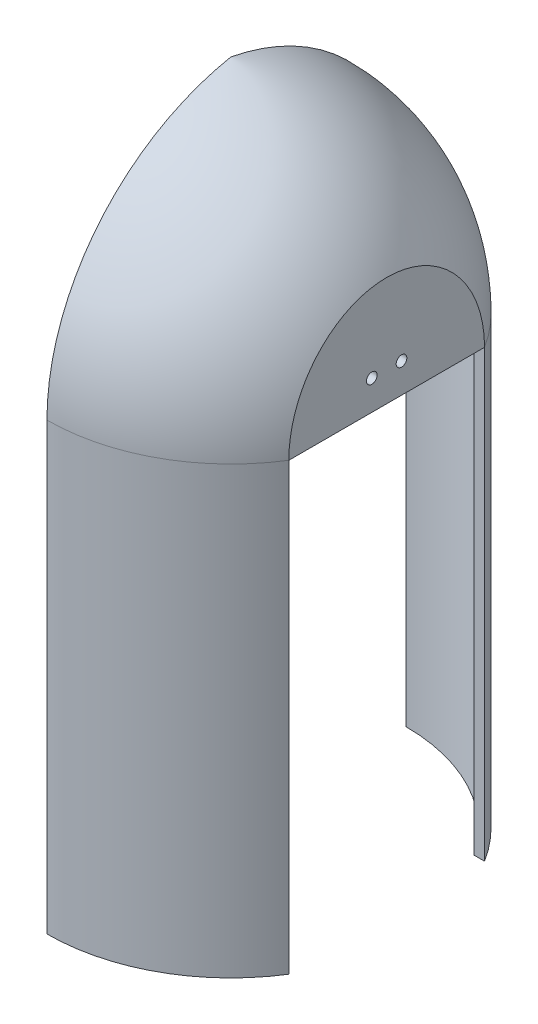
ISO-10303-21;
HEADER;
FILE_DESCRIPTION(('STEP AP214'),'2;1');
FILE_NAME('part.step','',(''),(''),'','','');
FILE_SCHEMA(('AUTOMOTIVE_DESIGN { 1 0 10303 214 1 1 1 1 }'));
ENDSEC;
DATA;
#1=APPLICATION_CONTEXT('core data for automotive mechanical design processes');
#2=APPLICATION_PROTOCOL_DEFINITION('international standard','automotive_design',2000,#1);
#3=PRODUCT_CONTEXT('',#1,'mechanical');
#4=PRODUCT('Part','Part','',(#3));
#5=PRODUCT_RELATED_PRODUCT_CATEGORY('part','',(#4));
#6=PRODUCT_DEFINITION_FORMATION('','',#4);
#7=PRODUCT_DEFINITION_CONTEXT('part definition',#1,'design');
#8=PRODUCT_DEFINITION('design','',#6,#7);
#9=PRODUCT_DEFINITION_SHAPE('','',#8);
#10=(LENGTH_UNIT() NAMED_UNIT(*) SI_UNIT(.MILLI.,.METRE.));
#11=(NAMED_UNIT(*) PLANE_ANGLE_UNIT() SI_UNIT($,.RADIAN.));
#12=(NAMED_UNIT(*) SI_UNIT($,.STERADIAN.) SOLID_ANGLE_UNIT());
#13=UNCERTAINTY_MEASURE_WITH_UNIT(LENGTH_MEASURE(1.E-05),#10,'distance_accuracy_value','');
#14=(GEOMETRIC_REPRESENTATION_CONTEXT(3) GLOBAL_UNCERTAINTY_ASSIGNED_CONTEXT((#13)) GLOBAL_UNIT_ASSIGNED_CONTEXT((#10,
#11,#12)) REPRESENTATION_CONTEXT('',''));
#15=CARTESIAN_POINT('',(0.,0.,0.));
#16=DIRECTION('',(0.,0.,1.));
#17=DIRECTION('',(1.,0.,0.));
#18=AXIS2_PLACEMENT_3D('',#15,#16,#17);
#19=CARTESIAN_POINT('',(0.,-150.,0.));
#20=DIRECTION('',(0.,1.,0.));
#21=DIRECTION('',(0.,0.,1.));
#22=AXIS2_PLACEMENT_3D('',#19,#20,#21);
#23=CYLINDRICAL_SURFACE('',#22,62.);
#24=DIRECTION('',(0.,1.,0.));
#25=VECTOR('',#24,1.);
#26=CARTESIAN_POINT('',(0.,81.3690947224046,62.));
#27=LINE('',#26,#25);
#28=CARTESIAN_POINT('',(0.,-150.,62.));
#29=VERTEX_POINT('',#28);
#30=CARTESIAN_POINT('',(0.,0.,62.));
#31=VERTEX_POINT('',#30);
#32=EDGE_CURVE('E140',#29,#31,#27,.T.);
#33=ORIENTED_EDGE('',*,*,#32,.F.);
#34=CARTESIAN_POINT('',(0.,-150.,0.));
#35=DIRECTION('',(0.,-1.,0.));
#36=DIRECTION('',(0.,0.,-1.));
#37=AXIS2_PLACEMENT_3D('',#34,#35,#36);
#38=CIRCLE('',#37,62.);
#39=CARTESIAN_POINT('',(52.5006628529583,-150.,32.98));
#40=VERTEX_POINT('',#39);
#41=EDGE_CURVE('E214',#40,#29,#38,.T.);
#42=ORIENTED_EDGE('',*,*,#41,.F.);
#43=DIRECTION('',(0.,1.,0.));
#44=VECTOR('',#43,1.);
#45=CARTESIAN_POINT('',(52.5006628529583,-150.,32.98));
#46=LINE('',#45,#44);
#47=CARTESIAN_POINT('',(52.5006628529583,0.,32.98));
#48=VERTEX_POINT('',#47);
#49=EDGE_CURVE('E217',#40,#48,#46,.T.);
#50=ORIENTED_EDGE('',*,*,#49,.T.);
#51=CARTESIAN_POINT('',(0.,0.,0.));
#52=DIRECTION('',(0.,-1.,0.));
#53=DIRECTION('',(0.,0.,-1.));
#54=AXIS2_PLACEMENT_3D('',#51,#52,#53);
#55=CIRCLE('',#54,62.);
#56=CARTESIAN_POINT('',(52.5,0.,32.981055168081));
#57=VERTEX_POINT('',#56);
#58=EDGE_CURVE('E212',#48,#57,#55,.T.);
#59=ORIENTED_EDGE('',*,*,#58,.T.);
#60=CARTESIAN_POINT('',(0.,0.,0.));
#61=DIRECTION('',(0.,1.,0.));
#62=DIRECTION('',(0.,0.,1.));
#63=AXIS2_PLACEMENT_3D('',#60,#61,#62);
#64=CIRCLE('',#63,62.);
#65=EDGE_CURVE('E146',#31,#57,#64,.T.);
#66=ORIENTED_EDGE('',*,*,#65,.F.);
#67=EDGE_LOOP('',(#33,#42,#50,#59,#66));
#68=FACE_BOUND('',#67,.T.);
#69=ADVANCED_FACE('F34',(#68),#23,.T.);
#70=CARTESIAN_POINT('',(62.,0.,0.));
#71=DIRECTION('',(0.,1.,0.));
#72=DIRECTION('',(0.,0.,1.));
#73=AXIS2_PLACEMENT_3D('',#70,#71,#72);
#74=PLANE('',#73);
#75=CARTESIAN_POINT('',(0.,0.,0.));
#76=DIRECTION('',(0.,1.,0.));
#77=DIRECTION('',(0.,0.,1.));
#78=AXIS2_PLACEMENT_3D('',#75,#76,#77);
#79=CIRCLE('',#78,59.);
#80=CARTESIAN_POINT('',(48.9215657966913,0.,-32.98));
#81=VERTEX_POINT('',#80);
#82=CARTESIAN_POINT('',(48.9208544487931,0.,-32.9810551680809));
#83=VERTEX_POINT('',#82);
#84=EDGE_CURVE('E130',#81,#83,#79,.T.);
#85=ORIENTED_EDGE('',*,*,#84,.F.);
#86=DIRECTION('',(-1.,0.,0.));
#87=VECTOR('',#86,1.);
#88=CARTESIAN_POINT('',(48.9215657966913,0.,-32.98));
#89=LINE('',#88,#87);
#90=CARTESIAN_POINT('',(52.5,0.,-32.98));
#91=VERTEX_POINT('',#90);
#92=EDGE_CURVE('E198',#91,#81,#89,.T.);
#93=ORIENTED_EDGE('',*,*,#92,.F.);
#94=DIRECTION('',(0.,0.,-1.));
#95=VECTOR('',#94,1.);
#96=CARTESIAN_POINT('',(52.5,0.,0.));
#97=LINE('',#96,#95);
#98=CARTESIAN_POINT('',(52.5,0.,32.98));
#99=VERTEX_POINT('',#98);
#100=EDGE_CURVE('E157',#99,#91,#97,.T.);
#101=ORIENTED_EDGE('',*,*,#100,.F.);
#102=DIRECTION('',(1.,0.,0.));
#103=VECTOR('',#102,1.);
#104=CARTESIAN_POINT('',(48.9215657966913,0.,32.98));
#105=LINE('',#104,#103);
#106=CARTESIAN_POINT('',(48.9215657966913,0.,32.98));
#107=VERTEX_POINT('',#106);
#108=EDGE_CURVE('E59',#107,#99,#105,.T.);
#109=ORIENTED_EDGE('',*,*,#108,.F.);
#110=CARTESIAN_POINT('',(0.,0.,0.));
#111=DIRECTION('',(0.,1.,0.));
#112=DIRECTION('',(0.,0.,-1.));
#113=AXIS2_PLACEMENT_3D('',#110,#111,#112);
#114=CIRCLE('',#113,59.);
#115=CARTESIAN_POINT('',(48.9208544487931,0.,32.981055168081));
#116=VERTEX_POINT('',#115);
#117=EDGE_CURVE('E208',#116,#107,#114,.T.);
#118=ORIENTED_EDGE('',*,*,#117,.F.);
#119=DIRECTION('',(0.,0.,-1.));
#120=VECTOR('',#119,1.);
#121=CARTESIAN_POINT('',(48.9208544487931,0.,32.9810551680809));
#122=LINE('',#121,#120);
#123=EDGE_CURVE('E227',#116,#83,#122,.T.);
#124=ORIENTED_EDGE('',*,*,#123,.T.);
#125=EDGE_LOOP('',(#85,#93,#101,#109,#118,#124));
#126=FACE_BOUND('',#125,.T.);
#127=ADVANCED_FACE('F248',(#126),#74,.F.);
#128=CARTESIAN_POINT('',(0.,0.,-14.3629032258065));
#129=DIRECTION('',(-1.,0.,0.));
#130=DIRECTION('',(0.,0.,1.));
#131=AXIS2_PLACEMENT_3D('',#128,#129,#130);
#132=CIRCLE('',#131,76.3629032258065);
#133=TRIMMED_CURVE('',#132,(PARAMETER_VALUE(-1.38158185655544)),
(PARAMETER_VALUE(1.38158185655544)),.T.,.PARAMETER.);
#134=CARTESIAN_POINT('',(0.,0.,0.));
#135=DIRECTION('',(0.,1.,0.));
#136=AXIS1_PLACEMENT('',#134,#135);
#137=SURFACE_OF_REVOLUTION('',#133,#136);
#138=CARTESIAN_POINT('',(52.5,0.,-32.981055168081));
#139=VERTEX_POINT('',#138);
#140=CARTESIAN_POINT('',(0.,0.,-62.));
#141=VERTEX_POINT('',#140);
#142=EDGE_CURVE('E135',#139,#141,#64,.T.);
#143=ORIENTED_EDGE('',*,*,#142,.T.);
#144=CARTESIAN_POINT('',(0.,0.,14.3629032258065));
#145=DIRECTION('',(1.,0.,0.));
#146=DIRECTION('',(0.,0.,-1.));
#147=AXIS2_PLACEMENT_3D('',#144,#145,#146);
#148=CIRCLE('',#147,76.3629032258065);
#149=CARTESIAN_POINT('',(0.,75.,0.));
#150=VERTEX_POINT('',#149);
#151=EDGE_CURVE('E124',#141,#150,#148,.T.);
#152=ORIENTED_EDGE('',*,*,#151,.T.);
#153=CARTESIAN_POINT('',(0.,0.,-14.3629032258065));
#154=DIRECTION('',(1.,0.,0.));
#155=DIRECTION('',(0.,0.,-1.));
#156=AXIS2_PLACEMENT_3D('',#153,#154,#155);
#157=CIRCLE('',#156,76.3629032258065);
#158=EDGE_CURVE('E127',#150,#31,#157,.T.);
#159=ORIENTED_EDGE('',*,*,#158,.T.);
#160=ORIENTED_EDGE('',*,*,#65,.T.);
#161=CARTESIAN_POINT('',(52.5,36.8869239879164,0.));
#162=CARTESIAN_POINT('',(52.5,36.8869271708803,0.85378771473573));
#163=CARTESIAN_POINT('',(52.5,36.8491281629657,1.70755006201001));
#164=CARTESIAN_POINT('',(52.5,36.6984562423363,3.40873789131229));
#165=CARTESIAN_POINT('',(52.5,36.5855558814184,4.25616094188717));
#166=CARTESIAN_POINT('',(52.5,36.2860243719502,5.9391029346563));
#167=CARTESIAN_POINT('',(52.5,36.0992873027986,6.77460298116176));
#168=CARTESIAN_POINT('',(52.5,35.6546303776749,8.42632747974476));
#169=CARTESIAN_POINT('',(52.5,35.396716519575,9.24255354969862));
#170=CARTESIAN_POINT('',(52.5,34.8140210069676,10.8474195233575));
#171=CARTESIAN_POINT('',(52.5,34.4894820209853,11.6361477169546));
#172=CARTESIAN_POINT('',(52.5,33.7767564535538,13.1842661822436));
#173=CARTESIAN_POINT('',(52.5,33.3885687624813,13.943655942177));
#174=CARTESIAN_POINT('',(52.5,32.5527763041705,15.4287423967091));
#175=CARTESIAN_POINT('',(52.5,32.1051837347277,16.1544459670227));
#176=CARTESIAN_POINT('',(52.5,31.1548145621312,17.5688074196995));
#177=CARTESIAN_POINT('',(52.5,30.6520325093269,18.2574616336247));
#178=CARTESIAN_POINT('',(52.5,29.569744334121,19.6274958717773));
#179=CARTESIAN_POINT('',(52.5,28.9876822875631,20.3068560949092));
#180=CARTESIAN_POINT('',(52.5,27.7727458267979,21.6184552130554));
#181=CARTESIAN_POINT('',(52.5,27.1398702264208,22.2506930073991));
#182=CARTESIAN_POINT('',(52.5,25.8281044081898,23.4657584453892));
#183=CARTESIAN_POINT('',(52.5,25.1492031192201,24.0485741245092));
#184=CARTESIAN_POINT('',(52.5,23.7503120311648,25.1626346374301));
#185=CARTESIAN_POINT('',(52.5,23.0303189678294,25.6938753651388));
#186=CARTESIAN_POINT('',(52.5,21.4720246753806,26.759062584904));
#187=CARTESIAN_POINT('',(52.5,20.629457694071,27.2867767262514));
#188=CARTESIAN_POINT('',(52.5,18.9055720714696,28.2745661186584));
#189=CARTESIAN_POINT('',(52.5,18.0242509800816,28.7346370851993));
#190=CARTESIAN_POINT('',(52.5,16.2285579980756,29.5857422019229));
#191=CARTESIAN_POINT('',(52.5,15.3141755964702,29.9767541599029));
#192=CARTESIAN_POINT('',(52.5,13.458393579121,30.688360787086));
#193=CARTESIAN_POINT('',(52.5,12.5169922962672,31.0089511005492));
#194=CARTESIAN_POINT('',(52.5,10.5272423503612,31.6043556387609));
#195=CARTESIAN_POINT('',(52.5,9.47688377654742,31.8724698166234));
#196=CARTESIAN_POINT('',(52.5,7.35792714885948,32.3229979282711));
#197=CARTESIAN_POINT('',(52.5,6.28932804787743,32.5054069248392));
#198=CARTESIAN_POINT('',(52.5,4.140682877016,32.7839482672814));
#199=CARTESIAN_POINT('',(52.5,3.06063410336558,32.88005975366));
#200=CARTESIAN_POINT('',(52.5,0.896325846587848,32.9856213526335));
#201=CARTESIAN_POINT('',(52.5,-0.187933657584905,32.9950710315294));
#202=CARTESIAN_POINT('',(52.5,-2.40497621700638,32.9256660138533));
#203=CARTESIAN_POINT('',(52.5,-3.5376309258414,32.8426171654452));
#204=CARTESIAN_POINT('',(52.5,-5.79197347332695,32.5817299852142));
#205=CARTESIAN_POINT('',(52.5,-6.91366087817352,32.4038879192348));
#206=CARTESIAN_POINT('',(52.5,-9.13833470547691,31.9539544046104));
#207=CARTESIAN_POINT('',(52.5,-10.241318255268,31.6818486133872));
#208=CARTESIAN_POINT('',(52.5,-11.8749955583861,31.2039167331855));
#209=CARTESIAN_POINT('',(52.5,-12.4161062581676,31.0329702844806));
#210=CARTESIAN_POINT('',(52.5,-13.4906327805905,30.6679119215343));
#211=CARTESIAN_POINT('',(52.5,-14.0240462784772,30.4737931662677));
#212=CARTESIAN_POINT('',(52.5,-15.6067728902105,29.8586049596716));
#213=CARTESIAN_POINT('',(52.5,-16.6430670366547,29.4033902258088));
#214=CARTESIAN_POINT('',(52.5,-18.6715050929651,28.4037938774468));
#215=CARTESIAN_POINT('',(52.5,-19.6636507253909,27.8594157457565));
#216=CARTESIAN_POINT('',(52.5,-21.5953142448542,26.6836380628385));
#217=CARTESIAN_POINT('',(52.5,-22.5348324237494,26.0522389942728));
#218=CARTESIAN_POINT('',(52.5,-23.8971495069049,25.0425572983735));
#219=CARTESIAN_POINT('',(52.5,-24.3434273229851,24.6955672740143));
#220=CARTESIAN_POINT('',(52.5,-25.2194643307245,23.9809533313647));
#221=CARTESIAN_POINT('',(52.5,-25.649216612017,23.613320935939));
#222=CARTESIAN_POINT('',(52.5,-26.8612371147559,22.5255677004045));
#223=CARTESIAN_POINT('',(52.5,-27.6208999319532,21.7799656069116));
#224=CARTESIAN_POINT('',(52.5,-29.068368681412,20.2220501826578));
#225=CARTESIAN_POINT('',(52.5,-29.7561864891889,19.4097479167772));
#226=CARTESIAN_POINT('',(52.5,-30.7274153573254,18.1454434845488));
#227=CARTESIAN_POINT('',(52.5,-31.0410488157606,17.7164091340955));
#228=CARTESIAN_POINT('',(52.5,-31.6471306775151,16.8438065454834));
#229=CARTESIAN_POINT('',(52.5,-31.9395845390433,16.40024209499));
#230=CARTESIAN_POINT('',(52.5,-32.783674851928,15.0487607209117));
#231=CARTESIAN_POINT('',(52.5,-33.3022355928964,14.1198019681138));
#232=CARTESIAN_POINT('',(52.5,-34.1910136283689,12.3182795902612));
#233=CARTESIAN_POINT('',(52.5,-34.5712440268446,11.4506253183023));
#234=CARTESIAN_POINT('',(52.5,-35.2495134776916,9.68368493212251));
#235=CARTESIAN_POINT('',(52.5,-35.5475586629919,8.78440118384646));
#236=CARTESIAN_POINT('',(52.5,-36.0566644836493,6.96225432074741));
#237=CARTESIAN_POINT('',(52.5,-36.2677916186814,6.03940980818281));
#238=CARTESIAN_POINT('',(52.5,-36.5999055179212,4.17764497170955));
#239=CARTESIAN_POINT('',(52.5,-36.7209006737681,3.23872615271038));
#240=CARTESIAN_POINT('',(52.5,-36.8626256405007,1.45526042149851));
#241=CARTESIAN_POINT('',(52.5,-36.8927556872991,0.611447889418169));
#242=CARTESIAN_POINT('',(52.5,-36.879233166245,-1.07554062275657));
#243=CARTESIAN_POINT('',(52.5,-36.8355870180683,-1.91871665184959));
#244=CARTESIAN_POINT('',(52.5,-36.6751400408604,-3.5979342818866));
#245=CARTESIAN_POINT('',(52.5,-36.5583495902401,-4.43397687793432));
#246=CARTESIAN_POINT('',(52.5,-36.2532210306955,-6.09289199355094));
#247=CARTESIAN_POINT('',(52.5,-36.0648821992447,-6.91576438003388));
#248=CARTESIAN_POINT('',(52.5,-35.6255995454002,-8.51893124333837));
#249=CARTESIAN_POINT('',(52.5,-35.3766297785007,-9.29976843561232));
#250=CARTESIAN_POINT('',(52.5,-34.8164671419251,-10.838733520845));
#251=CARTESIAN_POINT('',(52.5,-34.5052762090462,-11.5968621198241));
#252=CARTESIAN_POINT('',(52.5,-33.8239771728951,-13.0862381363847));
#253=CARTESIAN_POINT('',(52.5,-33.4538616692735,-13.8174821633093));
#254=CARTESIAN_POINT('',(52.5,-32.6583955812256,-15.2492677139671));
#255=CARTESIAN_POINT('',(52.5,-32.2330424206605,-15.9498078037104));
#256=CARTESIAN_POINT('',(52.5,-31.302014797856,-17.3607698156227));
#257=CARTESIAN_POINT('',(52.5,-30.7929397985387,-18.068947901799));
#258=CARTESIAN_POINT('',(52.5,-29.7212984001563,-19.4435578421657));
#259=CARTESIAN_POINT('',(52.5,-29.1587302817353,-20.1099883533784));
#260=CARTESIAN_POINT('',(52.5,-27.9846474211055,-21.3984970423504));
#261=CARTESIAN_POINT('',(52.5,-27.373120441502,-22.0205640574103));
#262=CARTESIAN_POINT('',(52.5,-26.1058081721551,-23.2179001389432));
#263=CARTESIAN_POINT('',(52.5,-25.4500183091811,-23.7931643561789));
#264=CARTESIAN_POINT('',(52.5,-24.0262041152055,-24.9540220339629));
#265=CARTESIAN_POINT('',(52.5,-23.2536852910207,-25.5341087213995));
#266=CARTESIAN_POINT('',(52.5,-21.6658122873122,-26.6323297270122));
#267=CARTESIAN_POINT('',(52.5,-20.850455483419,-27.1504602432022));
#268=CARTESIAN_POINT('',(52.5,-19.1823645903147,-28.1231402164067));
#269=CARTESIAN_POINT('',(52.5,-18.3296194820589,-28.5776707616111));
#270=CARTESIAN_POINT('',(52.5,-16.5924525028483,-29.4215575064081));
#271=CARTESIAN_POINT('',(52.5,-15.7080284720446,-29.8109092518441));
#272=CARTESIAN_POINT('',(52.5,-13.8242971055202,-30.5584045016926));
#273=CARTESIAN_POINT('',(52.5,-12.8222609557688,-30.9096849859914));
#274=CARTESIAN_POINT('',(52.5,-10.793289639863,-31.5309721298363));
#275=CARTESIAN_POINT('',(52.5,-9.76635295506939,-31.8009738187936));
#276=CARTESIAN_POINT('',(52.5,-7.69405430191652,-32.2588748591912));
#277=CARTESIAN_POINT('',(52.5,-6.64868745373991,-32.4467521160284));
#278=CARTESIAN_POINT('',(52.5,-4.54641195967799,-32.7397077244233));
#279=CARTESIAN_POINT('',(52.5,-3.48950296206816,-32.8447835455903));
#280=CARTESIAN_POINT('',(52.5,-1.3067296598623,-32.9756333150497));
#281=CARTESIAN_POINT('',(52.5,-0.180552354661898,-32.996240171672));
#282=CARTESIAN_POINT('',(52.5,2.06966190164308,-32.9439033300849));
#283=CARTESIAN_POINT('',(52.5,3.19369875413372,-32.870955421329));
#284=CARTESIAN_POINT('',(52.5,5.43175871783796,-32.6317627394137));
#285=CARTESIAN_POINT('',(52.5,6.54578235997487,-32.4655229428073));
#286=CARTESIAN_POINT('',(52.5,8.75649673181551,-32.0402431242468));
#287=CARTESIAN_POINT('',(52.5,9.85317960102313,-31.7811622095958));
#288=CARTESIAN_POINT('',(52.5,12.0326602119652,-31.167781137877));
#289=CARTESIAN_POINT('',(52.5,13.1151729083574,-30.8124658359542));
#290=CARTESIAN_POINT('',(52.5,15.2448177407881,-30.009525663952));
#291=CARTESIAN_POINT('',(52.5,16.291966237513,-29.5619441795421));
#292=CARTESIAN_POINT('',(52.5,18.34318827608,-28.5759323123145));
#293=CARTESIAN_POINT('',(52.5,19.3472502780609,-28.0374777790962));
#294=CARTESIAN_POINT('',(52.5,20.8135323206153,-27.1638141209836));
#295=CARTESIAN_POINT('',(52.5,21.2956621860352,-26.8615927744165));
#296=CARTESIAN_POINT('',(52.5,22.2458024451183,-26.2353403073282));
#297=CARTESIAN_POINT('',(52.5,22.7138074916395,-25.9113010736839));
#298=CARTESIAN_POINT('',(52.5,24.0540267355622,-24.9366623903841));
#299=CARTESIAN_POINT('',(52.5,24.9058447728255,-24.2576250288998));
#300=CARTESIAN_POINT('',(52.5,26.5440597600384,-22.8250826173584));
#301=CARTESIAN_POINT('',(52.5,27.3304638625203,-22.0715857286676));
#302=CARTESIAN_POINT('',(52.5,28.8293109838666,-20.4939840922705));
#303=CARTESIAN_POINT('',(52.5,29.5417604374332,-19.6698854989388));
#304=CARTESIAN_POINT('',(52.5,30.5477275712977,-18.3852774845354));
#305=CARTESIAN_POINT('',(52.5,30.872590687793,-17.9490108134718));
#306=CARTESIAN_POINT('',(52.5,31.5005416934137,-17.0607877495039));
#307=CARTESIAN_POINT('',(52.5,31.8036203960258,-16.6088248552637));
#308=CARTESIAN_POINT('',(52.5,32.6213540620552,-15.3205285388322));
#309=CARTESIAN_POINT('',(52.5,33.1100455103416,-14.4675108469003));
#310=CARTESIAN_POINT('',(52.5,34.0055919047158,-12.7196001348143));
#311=CARTESIAN_POINT('',(52.5,34.4124616802088,-11.8247147390922));
#312=CARTESIAN_POINT('',(52.5,34.9564541499292,-10.4574365987342));
#313=CARTESIAN_POINT('',(52.5,35.1266004916035,-9.99797470010997));
#314=CARTESIAN_POINT('',(52.5,35.4443491858916,-9.07146481441385));
#315=CARTESIAN_POINT('',(52.5,35.5919574813011,-8.60441886315224));
#316=CARTESIAN_POINT('',(52.5,35.9999481357159,-7.19364014181987));
#317=CARTESIAN_POINT('',(52.5,36.2257566635412,-6.23961384689929));
#318=CARTESIAN_POINT('',(52.5,36.5637272215482,-4.40705160507819));
#319=CARTESIAN_POINT('',(52.5,36.6847604718661,-3.5301260218074));
#320=CARTESIAN_POINT('',(52.5,36.8463574845824,-1.76879125412302));
#321=CARTESIAN_POINT('',(52.5,36.8869206908953,-0.88438201803633));
#322=CARTESIAN_POINT('',(52.5,36.8869239879164,0.));
#323=B_SPLINE_CURVE_WITH_KNOTS('',3,(#161,#162,#163,#164,#165,#166,#167,#168,#169,#170,#171,
#172,#173,#174,#175,#176,#177,#178,#179,#180,#181,#182,#183,#184,#185,#186,#187,#188,#189,#190,
#191,#192,#193,#194,#195,#196,#197,#198,#199,#200,#201,#202,#203,#204,#205,#206,#207,#208,#209,
#210,#211,#212,#213,#214,#215,#216,#217,#218,#219,#220,#221,#222,#223,#224,#225,#226,#227,#228,
#229,#230,#231,#232,#233,#234,#235,#236,#237,#238,#239,#240,#241,#242,#243,#244,#245,#246,#247,
#248,#249,#250,#251,#252,#253,#254,#255,#256,#257,#258,#259,#260,#261,#262,#263,#264,#265,#266,
#267,#268,#269,#270,#271,#272,#273,#274,#275,#276,#277,#278,#279,#280,#281,#282,#283,#284,#285,
#286,#287,#288,#289,#290,#291,#292,#293,#294,#295,#296,#297,#298,#299,#300,#301,#302,#303,#304,
#305,#306,#307,#308,#309,#310,#311,#312,#313,#314,#315,#316,#317,#318,#319,#320,#321,#322),
.UNSPECIFIED.,.T.,.F.,(4,2,2,2,2,2,2,2,2,2,2,2,2,2,2,2,2,2,2,2,2,2,2,2,2,2,2,2,2,2,2,2,2,2,2,2,
2,2,2,2,2,2,2,2,2,2,2,2,2,2,2,2,2,2,2,2,2,2,2,2,2,2,2,2,2,2,2,2,2,2,2,2,2,2,2,2,2,2,2,2,4),(0.,
2.56048838208532,5.12191309148482,7.6870256375381,10.2519220945851,12.8076371074584,
15.3633966802729,17.9186322802772,20.4741204227687,23.1551657092055,25.8362735990228,
28.5180287122258,31.1999971561099,34.1793677383201,37.1589269526396,40.1394419169419,
43.1201411810411,46.3686254962589,49.6172969239333,52.8667533964885,56.1162261309366,
59.5192609730619,62.9224298796708,66.3261168187409,68.028075329568,69.7305375481824,
73.1214604188269,76.5122508683057,79.9030225115126,81.5983988635807,83.2944766161669,
86.4831836957035,89.671362865717,91.2651541452368,92.8585332151717,96.0443341938533,
98.8824588720788,101.720371702822,104.556109236457,107.391582718841,109.921480184424,
112.451157520934,114.980476004002,117.509820029904,119.965809026833,122.42172158655,
124.877942828512,127.334278663324,129.948031057278,132.561867489899,135.176359309813,
137.791121673131,140.686261139757,143.581578177676,146.477754333127,149.374128325308,
152.556101568164,155.738269364461,158.921292759067,162.104413422282,165.479584361461,
168.854907209665,172.230050022099,175.606681277176,179.020420849775,182.432558850612,
185.845605092569,187.552160295134,189.259353634007,192.522650337372,195.785589752928,
199.048245025786,200.679482775034,202.311404431652,205.256313117989,208.200687585467,
209.670038898953,211.139002104688,214.074829434844,216.727051052915,219.37929099901),.UNSPECIFIED.);
#324=EDGE_CURVE('E144',#139,#57,#323,.T.);
#325=ORIENTED_EDGE('',*,*,#324,.F.);
#326=EDGE_LOOP('',(#143,#152,#159,#160,#325));
#327=FACE_BOUND('',#326,.T.);
#328=ADVANCED_FACE('F36',(#327),#137,.T.);
#329=CARTESIAN_POINT('',(0.,0.,-14.3629032258065));
#330=DIRECTION('',(-1.,0.,0.));
#331=DIRECTION('',(0.,0.,1.));
#332=AXIS2_PLACEMENT_3D('',#329,#330,#331);
#333=CIRCLE('',#332,73.3629032258065);
#334=TRIMMED_CURVE('',#333,(PARAMETER_VALUE(-1.37374474206706)),
(PARAMETER_VALUE(1.37374474206706)),.T.,.PARAMETER.);
#335=CARTESIAN_POINT('',(0.,0.,0.));
#336=DIRECTION('',(0.,1.,0.));
#337=AXIS1_PLACEMENT('',#335,#336);
#338=SURFACE_OF_REVOLUTION('',#334,#337);
#339=CARTESIAN_POINT('',(0.,0.,-14.3629032258065));
#340=DIRECTION('',(1.,0.,0.));
#341=DIRECTION('',(0.,0.,-1.));
#342=AXIS2_PLACEMENT_3D('',#339,#340,#341);
#343=CIRCLE('',#342,73.3629032258065);
#344=CARTESIAN_POINT('',(0.,0.,59.));
#345=VERTEX_POINT('',#344);
#346=CARTESIAN_POINT('',(0.,71.9431899532205,0.));
#347=VERTEX_POINT('',#346);
#348=EDGE_CURVE('E178',#345,#347,#343,.F.);
#349=ORIENTED_EDGE('',*,*,#348,.T.);
#350=CARTESIAN_POINT('',(0.,0.,14.3629032258065));
#351=DIRECTION('',(1.,0.,0.));
#352=DIRECTION('',(0.,0.,-1.));
#353=AXIS2_PLACEMENT_3D('',#350,#351,#352);
#354=CIRCLE('',#353,73.3629032258065);
#355=CARTESIAN_POINT('',(0.,0.,-59.));
#356=VERTEX_POINT('',#355);
#357=EDGE_CURVE('E175',#347,#356,#354,.F.);
#358=ORIENTED_EDGE('',*,*,#357,.T.);
#359=CARTESIAN_POINT('',(0.,0.,0.));
#360=DIRECTION('',(0.,1.,0.));
#361=DIRECTION('',(0.,0.,1.));
#362=AXIS2_PLACEMENT_3D('',#359,#360,#361);
#363=CIRCLE('',#362,59.);
#364=EDGE_CURVE('E148',#83,#356,#363,.T.);
#365=ORIENTED_EDGE('',*,*,#364,.F.);
#366=CARTESIAN_POINT('',(48.9208544487931,37.1117445602009,0.));
#367=CARTESIAN_POINT('',(48.9208544487931,37.1117444362736,-0.843195399837057));
#368=CARTESIAN_POINT('',(48.9208544487931,37.0745249591285,-1.68638179616617));
#369=CARTESIAN_POINT('',(48.9208544487931,36.9261744111579,-3.36651994399738));
#370=CARTESIAN_POINT('',(48.9208544487931,36.8150169669292,-4.20346936303525));
#371=CARTESIAN_POINT('',(48.9208544487931,36.5201727626115,-5.86568029144838));
#372=CARTESIAN_POINT('',(48.9208544487931,36.3363840088385,-6.69092366698064));
#373=CARTESIAN_POINT('',(48.9208544487931,35.8988552342689,-8.32254111656417));
#374=CARTESIAN_POINT('',(48.9208544487931,35.6451208777486,-9.12891671281605));
#375=CARTESIAN_POINT('',(48.9208544487931,35.0720708797718,-10.7145530600261));
#376=CARTESIAN_POINT('',(48.9208544487931,34.753004226611,-11.4939039928422));
#377=CARTESIAN_POINT('',(48.9208544487931,34.0524972615132,-13.0240109258301));
#378=CARTESIAN_POINT('',(48.9208544487931,33.6710559553927,-13.7747664699877));
#379=CARTESIAN_POINT('',(48.9208544487931,32.8499939230842,-15.2435275471251));
#380=CARTESIAN_POINT('',(48.9208544487931,32.4103836228804,-15.9615389181049));
#381=CARTESIAN_POINT('',(48.9208544487931,31.4771719122528,-17.3616095387868));
#382=CARTESIAN_POINT('',(48.9208544487931,30.9835649171117,-18.043665058851));
#383=CARTESIAN_POINT('',(48.9208544487931,29.9158636693686,-19.4083011100318));
#384=CARTESIAN_POINT('',(48.9208544487931,29.3387290288341,-20.0885023478604));
#385=CARTESIAN_POINT('',(48.9208544487931,28.1338085758637,-21.402403266952));
#386=CARTESIAN_POINT('',(48.9208544487931,27.5060212635488,-22.0361015701523));
#387=CARTESIAN_POINT('',(48.9208544487931,26.2045728676718,-23.2547996298654));
#388=CARTESIAN_POINT('',(48.9208544487931,25.5308998034979,-23.8397865787162));
#389=CARTESIAN_POINT('',(48.9208544487931,24.1425810849227,-24.9589580557612));
#390=CARTESIAN_POINT('',(48.9208544487931,23.4279320537462,-25.493138387377));
#391=CARTESIAN_POINT('',(48.9208544487931,21.8761507709017,-26.5687528267819));
#392=CARTESIAN_POINT('',(48.9208544487931,21.0344925439756,-27.1036663601184));
#393=CARTESIAN_POINT('',(48.9208544487931,19.3119783827456,-28.1061334112462));
#394=CARTESIAN_POINT('',(48.9208544487931,18.4311198231078,-28.5736824085711));
#395=CARTESIAN_POINT('',(48.9208544487931,16.6358926423909,-29.440045682196));
#396=CARTESIAN_POINT('',(48.9208544487931,15.7215131206127,-29.8388373544741));
#397=CARTESIAN_POINT('',(48.9208544487931,13.8652607679594,-30.566308263901));
#398=CARTESIAN_POINT('',(48.9208544487931,12.9233861879138,-30.8949830292789));
#399=CARTESIAN_POINT('',(48.9208544487931,10.9281499882724,-31.508821193188));
#400=CARTESIAN_POINT('',(48.9208544487931,9.87263105691767,-31.7869902467701));
#401=CARTESIAN_POINT('',(48.9208544487931,7.74258343310086,-32.2573229607635));
#402=CARTESIAN_POINT('',(48.9208544487931,6.66805360260871,-32.4494814541802));
#403=CARTESIAN_POINT('',(48.9208544487931,4.50679373617953,-32.7471952872484));
#404=CARTESIAN_POINT('',(48.9208544487931,3.42006074601127,-32.8527291771181));
#405=CARTESIAN_POINT('',(48.9208544487931,1.2416552319738,-32.976778377003));
#406=CARTESIAN_POINT('',(48.9208544487931,0.14998267543841,-32.9952931107015));
#407=CARTESIAN_POINT('',(48.9208544487931,-2.08519158720238,-32.9440010184968));
#408=CARTESIAN_POINT('',(48.9208544487931,-3.22859550465546,-32.8697954785901));
#409=CARTESIAN_POINT('',(48.9208544487931,-5.50515676378673,-32.625765624981));
#410=CARTESIAN_POINT('',(48.9208544487931,-6.63831368619064,-32.4559374165308));
#411=CARTESIAN_POINT('',(48.9208544487931,-8.88660245020543,-32.0211670448298));
#412=CARTESIAN_POINT('',(48.9208544487931,-10.0017314289345,-31.7562099269492));
#413=CARTESIAN_POINT('',(48.9208544487931,-11.6540861233884,-31.2883159854349));
#414=CARTESIAN_POINT('',(48.9208544487931,-12.2014994106052,-31.1206014247154));
#415=CARTESIAN_POINT('',(48.9208544487931,-13.2887801587746,-30.7617739304639));
#416=CARTESIAN_POINT('',(48.9208544487931,-13.8286453398347,-30.5706540905461));
#417=CARTESIAN_POINT('',(48.9208544487931,-15.4322995027606,-29.9635438114965));
#418=CARTESIAN_POINT('',(48.9208544487931,-16.483235521032,-29.5129293642156));
#419=CARTESIAN_POINT('',(48.9208544487931,-18.5413248618246,-28.5212697764282));
#420=CARTESIAN_POINT('',(48.9208544487931,-19.5484798678954,-27.9802281170813));
#421=CARTESIAN_POINT('',(48.9208544487931,-21.5104568724308,-26.8097546227684));
#422=CARTESIAN_POINT('',(48.9208544487931,-22.4652770398386,-26.1803196978979));
#423=CARTESIAN_POINT('',(48.9208544487931,-23.850602892312,-25.1724904508166));
#424=CARTESIAN_POINT('',(48.9208544487931,-24.3045590764031,-24.8259360529688));
#425=CARTESIAN_POINT('',(48.9208544487931,-25.1959525771483,-24.111811857949));
#426=CARTESIAN_POINT('',(48.9208544487931,-25.6333829092358,-23.7442333364461));
#427=CARTESIAN_POINT('',(48.9208544487931,-26.8675550713835,-22.6559871773318));
#428=CARTESIAN_POINT('',(48.9208544487931,-27.64164342778,-21.9093266037974));
#429=CARTESIAN_POINT('',(48.9208544487931,-29.1175597592255,-20.3477605909269));
#430=CARTESIAN_POINT('',(48.9208544487931,-29.8194002233001,-19.5328669909065));
#431=CARTESIAN_POINT('',(48.9208544487931,-30.8110789484752,-18.2634602645435));
#432=CARTESIAN_POINT('',(48.9208544487931,-31.1314271639797,-17.8325289598064));
#433=CARTESIAN_POINT('',(48.9208544487931,-31.750693781408,-16.9557152414008));
#434=CARTESIAN_POINT('',(48.9208544487931,-32.0496177000465,-16.5098367203295));
#435=CARTESIAN_POINT('',(48.9208544487931,-32.9126593822059,-15.1507821735069));
#436=CARTESIAN_POINT('',(48.9208544487931,-33.4432573937255,-14.2159188237827));
#437=CARTESIAN_POINT('',(48.9208544487931,-34.3508929843513,-12.4061081577285));
#438=CARTESIAN_POINT('',(48.9208544487931,-34.7385335025877,-11.5364457463922));
#439=CARTESIAN_POINT('',(48.9208544487931,-35.4307039277139,-9.76456373561319));
#440=CARTESIAN_POINT('',(48.9208544487931,-35.7352402851793,-8.86234666923334));
#441=CARTESIAN_POINT('',(48.9208544487931,-36.2560284967244,-7.03359467951463));
#442=CARTESIAN_POINT('',(48.9208544487931,-36.4723568452323,-6.10708157123731));
#443=CARTESIAN_POINT('',(48.9208544487931,-36.8133163231672,-4.23733965389442));
#444=CARTESIAN_POINT('',(48.9208544487931,-36.9379572160172,-3.29411263558239));
#445=CARTESIAN_POINT('',(48.9208544487931,-37.0842101497573,-1.51075980534964));
#446=CARTESIAN_POINT('',(48.9208544487931,-37.1161600869817,-0.67146665553215));
#447=CARTESIAN_POINT('',(48.9208544487931,-37.1063500623911,1.00664063638583));
#448=CARTESIAN_POINT('',(48.9208544487931,-37.0645970758026,1.84545481630059));
#449=CARTESIAN_POINT('',(48.9208544487931,-36.9080112841199,3.51608944122863));
#450=CARTESIAN_POINT('',(48.9208544487931,-36.7931886820867,4.34791084624852));
#451=CARTESIAN_POINT('',(48.9208544487931,-36.4921189188533,5.99851477401317));
#452=CARTESIAN_POINT('',(48.9208544487931,-36.3058709997471,6.81729715830271));
#453=CARTESIAN_POINT('',(48.9208544487931,-35.8717258921958,8.4095555787227));
#454=CARTESIAN_POINT('',(48.9208544487931,-35.6260432846333,9.18363767276699));
#455=CARTESIAN_POINT('',(48.9208544487931,-35.0731917591534,10.7094584256277));
#456=CARTESIAN_POINT('',(48.9208544487931,-34.7660249592318,11.4611978530759));
#457=CARTESIAN_POINT('',(48.9208544487931,-34.0935495404525,12.9382778716509));
#458=CARTESIAN_POINT('',(48.9208544487931,-33.7282332802684,13.6636149778784));
#459=CARTESIAN_POINT('',(48.9208544487931,-32.943162409879,15.0841887811901));
#460=CARTESIAN_POINT('',(48.9208544487931,-32.5234051031693,15.7794239850287));
#461=CARTESIAN_POINT('',(48.9208544487931,-31.6025094740374,17.1835972042604));
#462=CARTESIAN_POINT('',(48.9208544487931,-31.0977517294059,17.8901615673785));
#463=CARTESIAN_POINT('',(48.9208544487931,-30.0351313344353,19.2621132148776));
#464=CARTESIAN_POINT('',(48.9208544487931,-29.4772668429717,19.9274990703464));
#465=CARTESIAN_POINT('',(48.9208544487931,-28.312970886576,21.2145963734145));
#466=CARTESIAN_POINT('',(48.9208544487931,-27.7065266692803,21.8362962723538));
#467=CARTESIAN_POINT('',(48.9208544487931,-26.4497350917841,23.0336613825632));
#468=CARTESIAN_POINT('',(48.9208544487931,-25.7993830619799,23.6093216832463));
#469=CARTESIAN_POINT('',(48.9208544487931,-24.3825730325199,24.77583368349));
#470=CARTESIAN_POINT('',(48.9208544487931,-23.6113422963688,25.3608951286064));
#471=CARTESIAN_POINT('',(48.9208544487931,-22.0258086490165,26.4693929149871));
#472=CARTESIAN_POINT('',(48.9208544487931,-21.2115029344124,26.9928252381402));
#473=CARTESIAN_POINT('',(48.9208544487931,-19.5452609232306,27.9764817059374));
#474=CARTESIAN_POINT('',(48.9208544487931,-18.6933131223813,28.4366863476928));
#475=CARTESIAN_POINT('',(48.9208544487931,-16.957468885189,29.292314324013));
#476=CARTESIAN_POINT('',(48.9208544487931,-16.073570205046,29.6877330980595));
#477=CARTESIAN_POINT('',(48.9208544487931,-14.1862900956088,30.450137984741));
#478=CARTESIAN_POINT('',(48.9208544487931,-13.1800060251346,30.8099536985025));
#479=CARTESIAN_POINT('',(48.9208544487931,-11.1419104278491,31.4480991784941));
#480=CARTESIAN_POINT('',(48.9208544487931,-10.1100972728369,31.7264237327543));
#481=CARTESIAN_POINT('',(48.9208544487931,-8.02742875194822,32.2007490427321));
#482=CARTESIAN_POINT('',(48.9208544487931,-6.97656821641852,32.3967270889075));
#483=CARTESIAN_POINT('',(48.9208544487931,-4.86270760056333,32.7056413559186));
#484=CARTESIAN_POINT('',(48.9208544487931,-3.79970713322111,32.8185749217786));
#485=CARTESIAN_POINT('',(48.9208544487931,-1.60135277955739,32.96550543128));
#486=CARTESIAN_POINT('',(48.9208544487931,-0.465635533447783,32.9941178916583));
#487=CARTESIAN_POINT('',(48.9208544487931,1.80429625526533,32.9570673357759));
#488=CARTESIAN_POINT('',(48.9208544487931,2.93851072557941,32.8913999381058));
#489=CARTESIAN_POINT('',(48.9208544487931,5.19751470320448,32.6660148167129));
#490=CARTESIAN_POINT('',(48.9208544487931,6.32230469328104,32.5063019406789));
#491=CARTESIAN_POINT('',(48.9208544487931,8.5550970827046,32.0932954743982));
#492=CARTESIAN_POINT('',(48.9208544487931,9.66309185374177,31.8399606133664));
#493=CARTESIAN_POINT('',(48.9208544487931,11.8671617992729,31.2369434264201));
#494=CARTESIAN_POINT('',(48.9208544487931,12.9629260912048,30.8861220963611));
#495=CARTESIAN_POINT('',(48.9208544487931,15.119431940721,30.0910578245317));
#496=CARTESIAN_POINT('',(48.9208544487931,16.1801896366215,29.6468586469279));
#497=CARTESIAN_POINT('',(48.9208544487931,18.2589414367138,28.6664321720845));
#498=CARTESIAN_POINT('',(48.9208544487931,19.2769226962628,28.1301774753364));
#499=CARTESIAN_POINT('',(48.9208544487931,20.7641929733983,27.2588783453989));
#500=CARTESIAN_POINT('',(48.9208544487931,21.253336911472,26.9572895171707));
#501=CARTESIAN_POINT('',(48.9208544487931,22.2175291392724,26.3319783462589));
#502=CARTESIAN_POINT('',(48.9208544487931,22.6925720506781,26.0082477100707));
#503=CARTESIAN_POINT('',(48.9208544487931,24.053701527203,25.033719322936));
#504=CARTESIAN_POINT('',(48.9208544487931,24.9193687388847,24.3539998025176));
#505=CARTESIAN_POINT('',(48.9208544487931,26.5850223248897,22.9186937274092));
#506=CARTESIAN_POINT('',(48.9208544487931,27.3850161569269,22.1631158087419));
#507=CARTESIAN_POINT('',(48.9208544487931,28.9105197974335,20.579837281374));
#508=CARTESIAN_POINT('',(48.9208544487931,29.6360361742991,19.7521430447571));
#509=CARTESIAN_POINT('',(48.9208544487931,30.6609157391046,18.4609448356414));
#510=CARTESIAN_POINT('',(48.9208544487931,30.9919669663647,18.0222839382929));
#511=CARTESIAN_POINT('',(48.9208544487931,31.6320168128558,17.1288578892667));
#512=CARTESIAN_POINT('',(48.9208544487931,31.9410059513807,16.674085938319));
#513=CARTESIAN_POINT('',(48.9208544487931,32.7729555841506,15.3802488049383));
#514=CARTESIAN_POINT('',(48.9208544487931,33.2698304866329,14.5242028976455));
#515=CARTESIAN_POINT('',(48.9208544487931,34.1807952301628,12.7691850392612));
#516=CARTESIAN_POINT('',(48.9208544487931,34.5949012504719,11.8702215201436));
#517=CARTESIAN_POINT('',(48.9208544487931,35.1487090833936,10.4961602864421));
#518=CARTESIAN_POINT('',(48.9208544487931,35.3219448918623,10.0343515921884));
#519=CARTESIAN_POINT('',(48.9208544487931,35.6454997210289,9.10286848311392));
#520=CARTESIAN_POINT('',(48.9208544487931,35.795824799494,8.63319618406798));
#521=CARTESIAN_POINT('',(48.9208544487931,36.0728652090454,7.68716217090219));
#522=CARTESIAN_POINT('',(48.9208544487931,36.1995910723258,7.21080354342235));
#523=CARTESIAN_POINT('',(48.9208544487931,36.4289434045653,6.25233299286677));
#524=CARTESIAN_POINT('',(48.9208544487931,36.5315689105176,5.77022084069917));
#525=CARTESIAN_POINT('',(48.9208544487931,36.7842680006247,4.41490174754679));
#526=CARTESIAN_POINT('',(48.9208544487931,36.9069154939502,3.53640832847106));
#527=CARTESIAN_POINT('',(48.9208544487931,37.0706539341167,1.77193997123086));
#528=CARTESIAN_POINT('',(48.9208544487931,37.1117446904143,0.885965015591893));
#529=CARTESIAN_POINT('',(48.9208544487931,37.1117445602009,0.));
#530=B_SPLINE_CURVE_WITH_KNOTS('',3,(#366,#367,#368,#369,#370,#371,#372,#373,#374,#375,#376,
#377,#378,#379,#380,#381,#382,#383,#384,#385,#386,#387,#388,#389,#390,#391,#392,#393,#394,#395,
#396,#397,#398,#399,#400,#401,#402,#403,#404,#405,#406,#407,#408,#409,#410,#411,#412,#413,#414,
#415,#416,#417,#418,#419,#420,#421,#422,#423,#424,#425,#426,#427,#428,#429,#430,#431,#432,#433,
#434,#435,#436,#437,#438,#439,#440,#441,#442,#443,#444,#445,#446,#447,#448,#449,#450,#451,#452,
#453,#454,#455,#456,#457,#458,#459,#460,#461,#462,#463,#464,#465,#466,#467,#468,#469,#470,#471,
#472,#473,#474,#475,#476,#477,#478,#479,#480,#481,#482,#483,#484,#485,#486,#487,#488,#489,#490,
#491,#492,#493,#494,#495,#496,#497,#498,#499,#500,#501,#502,#503,#504,#505,#506,#507,#508,#509,
#510,#511,#512,#513,#514,#515,#516,#517,#518,#519,#520,#521,#522,#523,#524,#525,#526,#527,#528,
#529),.UNSPECIFIED.,.T.,.F.,(4,2,2,2,2,2,2,2,2,2,2,2,2,2,2,2,2,2,2,2,2,2,2,2,2,2,2,2,2,2,2,2,2,
2,2,2,2,2,2,2,2,2,2,2,2,2,2,2,2,2,2,2,2,2,2,2,2,2,2,2,2,2,2,2,2,2,2,2,2,2,2,2,2,2,2,2,2,2,2,2,2,
4),(0.,2.52875514242928,5.05841276664629,7.59163539854397,10.1246529473581,12.6481908110342,
15.1717689010496,17.6948952858978,20.2182828773639,22.8916831885549,25.5651626910199,
28.2393429255523,30.9137438533594,33.9023386331752,36.8911338679623,39.8809098056162,
42.8708763620399,46.1419027913114,49.4131256977174,52.6851583725464,55.9572127175976,
59.3905597865593,62.8240467071756,66.2580736216227,67.975203326151,69.6928409445142,
73.1185198115349,76.5440668311931,79.9697336252354,81.6825534926121,83.3960893554913,
86.6179604642732,89.8392736904803,91.4495855082612,93.05948117296,96.2782540607363,
99.1308051915305,101.983134843232,104.832985652462,107.682532948763,110.199079329854,
112.715387558388,115.231344499807,117.747328139201,120.181056264107,122.614700566829,
125.048664935224,127.482749905709,130.085056754206,132.68745385332,135.290536344434,
137.893896111264,140.794952334711,143.696197597347,146.598335763758,149.500678134782,
152.703196917984,155.905920481528,159.109526714255,162.313235363501,165.717513080393,
169.121949007294,172.526209463759,175.931972392304,179.379333655199,182.825082802752,
186.271859330867,187.995277814389,189.719345399982,193.016432674565,196.313145020286,
199.609566368551,201.257672872191,202.906483403765,205.871453407119,208.835843264411,
210.315042436954,211.79384981718,213.271995624135,214.750200485075,217.407216113187,
220.06423794896),.UNSPECIFIED.);
#531=EDGE_CURVE('E228',#116,#83,#530,.T.);
#532=ORIENTED_EDGE('',*,*,#531,.F.);
#533=EDGE_CURVE('E145',#345,#116,#363,.T.);
#534=ORIENTED_EDGE('',*,*,#533,.F.);
#535=EDGE_LOOP('',(#349,#358,#365,#532,#534));
#536=FACE_BOUND('',#535,.T.);
#537=ADVANCED_FACE('F302',(#536),#338,.F.);
#538=CARTESIAN_POINT('',(52.5,75.,-72.8837101672634));
#539=DIRECTION('',(1.,0.,0.));
#540=DIRECTION('',(0.,0.,-1.));
#541=AXIS2_PLACEMENT_3D('',#538,#539,#540);
#542=PLANE('',#541);
#543=CARTESIAN_POINT('',(52.5,10.,5.));
#544=DIRECTION('',(1.,0.,0.));
#545=DIRECTION('',(0.,0.,-1.));
#546=AXIS2_PLACEMENT_3D('',#543,#544,#545);
#547=CIRCLE('',#546,1.8);
#548=CARTESIAN_POINT('',(52.5,10.,3.2));
#549=VERTEX_POINT('',#548);
#550=EDGE_CURVE('E168',#549,#549,#547,.T.);
#551=ORIENTED_EDGE('',*,*,#550,.F.);
#552=EDGE_LOOP('',(#551));
#553=FACE_BOUND('',#552,.T.);
#554=CARTESIAN_POINT('',(52.5,10.,-5.));
#555=DIRECTION('',(1.,0.,0.));
#556=DIRECTION('',(0.,0.,-1.));
#557=AXIS2_PLACEMENT_3D('',#554,#555,#556);
#558=CIRCLE('',#557,1.8);
#559=CARTESIAN_POINT('',(52.5,10.,-6.8));
#560=VERTEX_POINT('',#559);
#561=EDGE_CURVE('E160',#560,#560,#558,.T.);
#562=ORIENTED_EDGE('',*,*,#561,.F.);
#563=EDGE_LOOP('',(#562));
#564=FACE_BOUND('',#563,.T.);
#565=ORIENTED_EDGE('',*,*,#324,.T.);
#566=EDGE_CURVE('E44',#57,#99,#97,.T.);
#567=ORIENTED_EDGE('',*,*,#566,.T.);
#568=ORIENTED_EDGE('',*,*,#100,.T.);
#569=DIRECTION('',(0.,0.,1.));
#570=VECTOR('',#569,1.);
#571=CARTESIAN_POINT('',(52.5,0.,-72.8837101672634));
#572=LINE('',#571,#570);
#573=EDGE_CURVE('E206',#139,#91,#572,.T.);
#574=ORIENTED_EDGE('',*,*,#573,.F.);
#575=EDGE_LOOP('',(#565,#567,#568,#574));
#576=FACE_BOUND('',#575,.T.);
#577=ADVANCED_FACE('F291',(#553,#564,#576),#542,.T.);
#578=CARTESIAN_POINT('',(48.9208544487931,75.001,32.9810551680809));
#579=DIRECTION('',(-1.,0.,0.));
#580=DIRECTION('',(0.,0.,1.));
#581=AXIS2_PLACEMENT_3D('',#578,#579,#580);
#582=PLANE('',#581);
#583=CARTESIAN_POINT('',(48.9208544487931,10.,5.));
#584=DIRECTION('',(-1.,0.,0.));
#585=DIRECTION('',(0.,0.,1.));
#586=AXIS2_PLACEMENT_3D('',#583,#584,#585);
#587=CIRCLE('',#586,1.8);
#588=CARTESIAN_POINT('',(48.9208544487931,10.,6.8));
#589=VERTEX_POINT('',#588);
#590=EDGE_CURVE('E39',#589,#589,#587,.T.);
#591=ORIENTED_EDGE('',*,*,#590,.F.);
#592=EDGE_LOOP('',(#591));
#593=FACE_BOUND('',#592,.T.);
#594=CARTESIAN_POINT('',(48.9208544487931,10.,-5.));
#595=DIRECTION('',(-1.,0.,0.));
#596=DIRECTION('',(0.,0.,1.));
#597=AXIS2_PLACEMENT_3D('',#594,#595,#596);
#598=CIRCLE('',#597,1.8);
#599=CARTESIAN_POINT('',(48.9208544487931,10.,-3.2));
#600=VERTEX_POINT('',#599);
#601=EDGE_CURVE('E158',#600,#600,#598,.T.);
#602=ORIENTED_EDGE('',*,*,#601,.F.);
#603=EDGE_LOOP('',(#602));
#604=FACE_BOUND('',#603,.T.);
#605=ORIENTED_EDGE('',*,*,#123,.F.);
#606=ORIENTED_EDGE('',*,*,#531,.T.);
#607=EDGE_LOOP('',(#605,#606));
#608=FACE_BOUND('',#607,.T.);
#609=ADVANCED_FACE('F234',(#593,#604,#608),#582,.T.);
#610=CARTESIAN_POINT('',(0.,-150.,0.));
#611=DIRECTION('',(0.,1.,0.));
#612=DIRECTION('',(0.,0.,1.));
#613=AXIS2_PLACEMENT_3D('',#610,#611,#612);
#614=CYLINDRICAL_SURFACE('',#613,59.);
#615=CARTESIAN_POINT('',(0.,-150.,0.));
#616=DIRECTION('',(0.,1.,0.));
#617=DIRECTION('',(0.,0.,-1.));
#618=AXIS2_PLACEMENT_3D('',#615,#616,#617);
#619=CIRCLE('',#618,59.);
#620=CARTESIAN_POINT('',(0.,-150.,59.));
#621=VERTEX_POINT('',#620);
#622=CARTESIAN_POINT('',(48.9215657966913,-150.,32.98));
#623=VERTEX_POINT('',#622);
#624=EDGE_CURVE('E209',#621,#623,#619,.T.);
#625=ORIENTED_EDGE('',*,*,#624,.F.);
#626=DIRECTION('',(0.,1.,0.));
#627=VECTOR('',#626,1.);
#628=CARTESIAN_POINT('',(0.,-150.,59.));
#629=LINE('',#628,#627);
#630=EDGE_CURVE('E181',#621,#345,#629,.T.);
#631=ORIENTED_EDGE('',*,*,#630,.T.);
#632=ORIENTED_EDGE('',*,*,#533,.T.);
#633=ORIENTED_EDGE('',*,*,#117,.T.);
#634=DIRECTION('',(0.,1.,0.));
#635=VECTOR('',#634,1.);
#636=CARTESIAN_POINT('',(48.9215657966913,-150.,32.98));
#637=LINE('',#636,#635);
#638=EDGE_CURVE('E225',#623,#107,#637,.T.);
#639=ORIENTED_EDGE('',*,*,#638,.F.);
#640=EDGE_LOOP('',(#625,#631,#632,#633,#639));
#641=FACE_BOUND('',#640,.T.);
#642=ADVANCED_FACE('F238',(#641),#614,.F.);
#643=CARTESIAN_POINT('',(48.9215657966913,-150.,32.98));
#644=DIRECTION('',(0.,0.,1.));
#645=DIRECTION('',(1.,0.,0.));
#646=AXIS2_PLACEMENT_3D('',#643,#644,#645);
#647=PLANE('',#646);
#648=ORIENTED_EDGE('',*,*,#108,.T.);
#649=EDGE_CURVE('E219',#99,#48,#105,.T.);
#650=ORIENTED_EDGE('',*,*,#649,.T.);
#651=ORIENTED_EDGE('',*,*,#49,.F.);
#652=DIRECTION('',(1.,0.,0.));
#653=VECTOR('',#652,1.);
#654=CARTESIAN_POINT('',(48.9215657966913,-150.,32.98));
#655=LINE('',#654,#653);
#656=EDGE_CURVE('E211',#623,#40,#655,.T.);
#657=ORIENTED_EDGE('',*,*,#656,.F.);
#658=ORIENTED_EDGE('',*,*,#638,.T.);
#659=EDGE_LOOP('',(#648,#650,#651,#657,#658));
#660=FACE_BOUND('',#659,.T.);
#661=ADVANCED_FACE('F241',(#660),#647,.F.);
#662=CARTESIAN_POINT('',(0.,-150.,0.));
#663=DIRECTION('',(0.,-1.,0.));
#664=DIRECTION('',(0.,0.,-1.));
#665=AXIS2_PLACEMENT_3D('',#662,#663,#664);
#666=PLANE('',#665);
#667=DIRECTION('',(0.,0.,1.));
#668=VECTOR('',#667,1.);
#669=CARTESIAN_POINT('',(0.,-150.,0.));
#670=LINE('',#669,#668);
#671=EDGE_CURVE('E184',#621,#29,#670,.T.);
#672=ORIENTED_EDGE('',*,*,#671,.F.);
#673=ORIENTED_EDGE('',*,*,#624,.T.);
#674=ORIENTED_EDGE('',*,*,#656,.T.);
#675=ORIENTED_EDGE('',*,*,#41,.T.);
#676=EDGE_LOOP('',(#672,#673,#674,#675));
#677=FACE_BOUND('',#676,.T.);
#678=ADVANCED_FACE('F245',(#677),#666,.T.);
#679=CARTESIAN_POINT('',(0.,0.,0.));
#680=DIRECTION('',(0.,-1.,0.));
#681=DIRECTION('',(0.,0.,-1.));
#682=AXIS2_PLACEMENT_3D('',#679,#680,#681);
#683=PLANE('',#682);
#684=ORIENTED_EDGE('',*,*,#566,.F.);
#685=ORIENTED_EDGE('',*,*,#58,.F.);
#686=ORIENTED_EDGE('',*,*,#649,.F.);
#687=EDGE_LOOP('',(#684,#685,#686));
#688=FACE_BOUND('',#687,.T.);
#689=ADVANCED_FACE('F250',(#688),#683,.F.);
#690=CARTESIAN_POINT('',(0.,-150.,0.));
#691=DIRECTION('',(0.,1.,0.));
#692=DIRECTION('',(0.,0.,1.));
#693=AXIS2_PLACEMENT_3D('',#690,#691,#692);
#694=CYLINDRICAL_SURFACE('',#693,59.);
#695=ORIENTED_EDGE('',*,*,#364,.T.);
#696=DIRECTION('',(0.,1.,0.));
#697=VECTOR('',#696,1.);
#698=CARTESIAN_POINT('',(0.,-150.,-59.));
#699=LINE('',#698,#697);
#700=CARTESIAN_POINT('',(0.,-150.,-59.));
#701=VERTEX_POINT('',#700);
#702=EDGE_CURVE('E139',#356,#701,#699,.F.);
#703=ORIENTED_EDGE('',*,*,#702,.T.);
#704=CARTESIAN_POINT('',(0.,-150.,0.));
#705=DIRECTION('',(0.,1.,0.));
#706=DIRECTION('',(0.,0.,1.));
#707=AXIS2_PLACEMENT_3D('',#704,#705,#706);
#708=CIRCLE('',#707,59.);
#709=CARTESIAN_POINT('',(48.9215657966913,-150.,-32.98));
#710=VERTEX_POINT('',#709);
#711=EDGE_CURVE('E187',#710,#701,#708,.T.);
#712=ORIENTED_EDGE('',*,*,#711,.F.);
#713=DIRECTION('',(0.,1.,0.));
#714=VECTOR('',#713,1.);
#715=CARTESIAN_POINT('',(48.9215657966913,-150.,-32.98));
#716=LINE('',#715,#714);
#717=EDGE_CURVE('E194',#710,#81,#716,.T.);
#718=ORIENTED_EDGE('',*,*,#717,.T.);
#719=ORIENTED_EDGE('',*,*,#84,.T.);
#720=EDGE_LOOP('',(#695,#703,#712,#718,#719));
#721=FACE_BOUND('',#720,.T.);
#722=ADVANCED_FACE('F253',(#721),#694,.F.);
#723=CARTESIAN_POINT('',(0.,-150.,0.));
#724=DIRECTION('',(0.,1.,0.));
#725=DIRECTION('',(0.,0.,1.));
#726=AXIS2_PLACEMENT_3D('',#723,#724,#725);
#727=CYLINDRICAL_SURFACE('',#726,62.);
#728=CARTESIAN_POINT('',(0.,-150.,0.));
#729=DIRECTION('',(0.,-1.,0.));
#730=DIRECTION('',(0.,0.,1.));
#731=AXIS2_PLACEMENT_3D('',#728,#729,#730);
#732=CIRCLE('',#731,62.);
#733=CARTESIAN_POINT('',(0.,-150.,-62.));
#734=VERTEX_POINT('',#733);
#735=CARTESIAN_POINT('',(52.5006628529583,-150.,-32.98));
#736=VERTEX_POINT('',#735);
#737=EDGE_CURVE('E138',#734,#736,#732,.T.);
#738=ORIENTED_EDGE('',*,*,#737,.F.);
#739=DIRECTION('',(0.,1.,0.));
#740=VECTOR('',#739,1.);
#741=CARTESIAN_POINT('',(0.,81.3690947224046,-62.));
#742=LINE('',#741,#740);
#743=EDGE_CURVE('E52',#734,#141,#742,.T.);
#744=ORIENTED_EDGE('',*,*,#743,.T.);
#745=ORIENTED_EDGE('',*,*,#142,.F.);
#746=CARTESIAN_POINT('',(0.,0.,0.));
#747=DIRECTION('',(0.,-1.,0.));
#748=DIRECTION('',(0.,0.,1.));
#749=AXIS2_PLACEMENT_3D('',#746,#747,#748);
#750=CIRCLE('',#749,62.);
#751=CARTESIAN_POINT('',(52.5006628529583,0.,-32.98));
#752=VERTEX_POINT('',#751);
#753=EDGE_CURVE('E196',#139,#752,#750,.T.);
#754=ORIENTED_EDGE('',*,*,#753,.T.);
#755=DIRECTION('',(0.,1.,0.));
#756=VECTOR('',#755,1.);
#757=CARTESIAN_POINT('',(52.5006628529583,-150.,-32.98));
#758=LINE('',#757,#756);
#759=EDGE_CURVE('E203',#736,#752,#758,.T.);
#760=ORIENTED_EDGE('',*,*,#759,.F.);
#761=EDGE_LOOP('',(#738,#744,#745,#754,#760));
#762=FACE_BOUND('',#761,.T.);
#763=ADVANCED_FACE('F134',(#762),#727,.T.);
#764=CARTESIAN_POINT('',(48.9215657966913,-150.,-32.98));
#765=DIRECTION('',(0.,0.,-1.));
#766=DIRECTION('',(-1.,0.,0.));
#767=AXIS2_PLACEMENT_3D('',#764,#765,#766);
#768=PLANE('',#767);
#769=EDGE_CURVE('E190',#752,#91,#89,.T.);
#770=ORIENTED_EDGE('',*,*,#769,.T.);
#771=ORIENTED_EDGE('',*,*,#92,.T.);
#772=ORIENTED_EDGE('',*,*,#717,.F.);
#773=DIRECTION('',(-1.,0.,0.));
#774=VECTOR('',#773,1.);
#775=CARTESIAN_POINT('',(48.9215657966913,-150.,-32.98));
#776=LINE('',#775,#774);
#777=EDGE_CURVE('E192',#736,#710,#776,.T.);
#778=ORIENTED_EDGE('',*,*,#777,.F.);
#779=ORIENTED_EDGE('',*,*,#759,.T.);
#780=EDGE_LOOP('',(#770,#771,#772,#778,#779));
#781=FACE_BOUND('',#780,.T.);
#782=ADVANCED_FACE('F263',(#781),#768,.F.);
#783=CARTESIAN_POINT('',(0.,-150.,0.));
#784=DIRECTION('',(0.,1.,0.));
#785=DIRECTION('',(0.,0.,1.));
#786=AXIS2_PLACEMENT_3D('',#783,#784,#785);
#787=PLANE('',#786);
#788=ORIENTED_EDGE('',*,*,#711,.T.);
#789=DIRECTION('',(0.,0.,-1.));
#790=VECTOR('',#789,1.);
#791=CARTESIAN_POINT('',(0.,-150.,0.));
#792=LINE('',#791,#790);
#793=EDGE_CURVE('E12',#701,#734,#792,.T.);
#794=ORIENTED_EDGE('',*,*,#793,.T.);
#795=ORIENTED_EDGE('',*,*,#737,.T.);
#796=ORIENTED_EDGE('',*,*,#777,.T.);
#797=EDGE_LOOP('',(#788,#794,#795,#796));
#798=FACE_BOUND('',#797,.T.);
#799=ADVANCED_FACE('F266',(#798),#787,.F.);
#800=CARTESIAN_POINT('',(0.,0.,0.));
#801=DIRECTION('',(0.,1.,0.));
#802=DIRECTION('',(0.,0.,1.));
#803=AXIS2_PLACEMENT_3D('',#800,#801,#802);
#804=PLANE('',#803);
#805=ORIENTED_EDGE('',*,*,#753,.F.);
#806=ORIENTED_EDGE('',*,*,#573,.T.);
#807=ORIENTED_EDGE('',*,*,#769,.F.);
#808=EDGE_LOOP('',(#805,#806,#807));
#809=FACE_BOUND('',#808,.T.);
#810=ADVANCED_FACE('F268',(#809),#804,.T.);
#811=CARTESIAN_POINT('',(0.,81.3690947224046,-62.));
#812=DIRECTION('',(1.,0.,0.));
#813=DIRECTION('',(0.,0.,-1.));
#814=AXIS2_PLACEMENT_3D('',#811,#812,#813);
#815=PLANE('',#814);
#816=ORIENTED_EDGE('',*,*,#743,.F.);
#817=ORIENTED_EDGE('',*,*,#793,.F.);
#818=ORIENTED_EDGE('',*,*,#702,.F.);
#819=ORIENTED_EDGE('',*,*,#357,.F.);
#820=ORIENTED_EDGE('',*,*,#348,.F.);
#821=ORIENTED_EDGE('',*,*,#630,.F.);
#822=ORIENTED_EDGE('',*,*,#671,.T.);
#823=ORIENTED_EDGE('',*,*,#32,.T.);
#824=ORIENTED_EDGE('',*,*,#158,.F.);
#825=ORIENTED_EDGE('',*,*,#151,.F.);
#826=EDGE_LOOP('',(#816,#817,#818,#819,#820,#821,#822,#823,#824,#825));
#827=FACE_BOUND('',#826,.T.);
#828=ADVANCED_FACE('F125',(#827),#815,.F.);
#829=CARTESIAN_POINT('',(0.,10.,-5.));
#830=DIRECTION('',(1.,0.,0.));
#831=DIRECTION('',(0.,0.,-1.));
#832=AXIS2_PLACEMENT_3D('',#829,#830,#831);
#833=CYLINDRICAL_SURFACE('',#832,1.8);
#834=ORIENTED_EDGE('',*,*,#561,.T.);
#835=EDGE_LOOP('',(#834));
#836=FACE_BOUND('',#835,.T.);
#837=ORIENTED_EDGE('',*,*,#601,.T.);
#838=EDGE_LOOP('',(#837));
#839=FACE_BOUND('',#838,.T.);
#840=ADVANCED_FACE('F277',(#836,#839),#833,.F.);
#841=CARTESIAN_POINT('',(0.,10.,5.));
#842=DIRECTION('',(1.,0.,0.));
#843=DIRECTION('',(0.,0.,-1.));
#844=AXIS2_PLACEMENT_3D('',#841,#842,#843);
#845=CYLINDRICAL_SURFACE('',#844,1.8);
#846=ORIENTED_EDGE('',*,*,#550,.T.);
#847=EDGE_LOOP('',(#846));
#848=FACE_BOUND('',#847,.T.);
#849=ORIENTED_EDGE('',*,*,#590,.T.);
#850=EDGE_LOOP('',(#849));
#851=FACE_BOUND('',#850,.T.);
#852=ADVANCED_FACE('F280',(#848,#851),#845,.F.);
#853=CLOSED_SHELL('',(#69,#127,#328,#537,#577,#609,#642,#661,#678,#689,#722,#763,#782,#799,#810,
#828,#840,#852));
#854=MANIFOLD_SOLID_BREP('B2',#853);
#855=ADVANCED_BREP_SHAPE_REPRESENTATION('',(#18,#854),#14);
#856=SHAPE_DEFINITION_REPRESENTATION(#9,#855);
ENDSEC;
END-ISO-10303-21;
